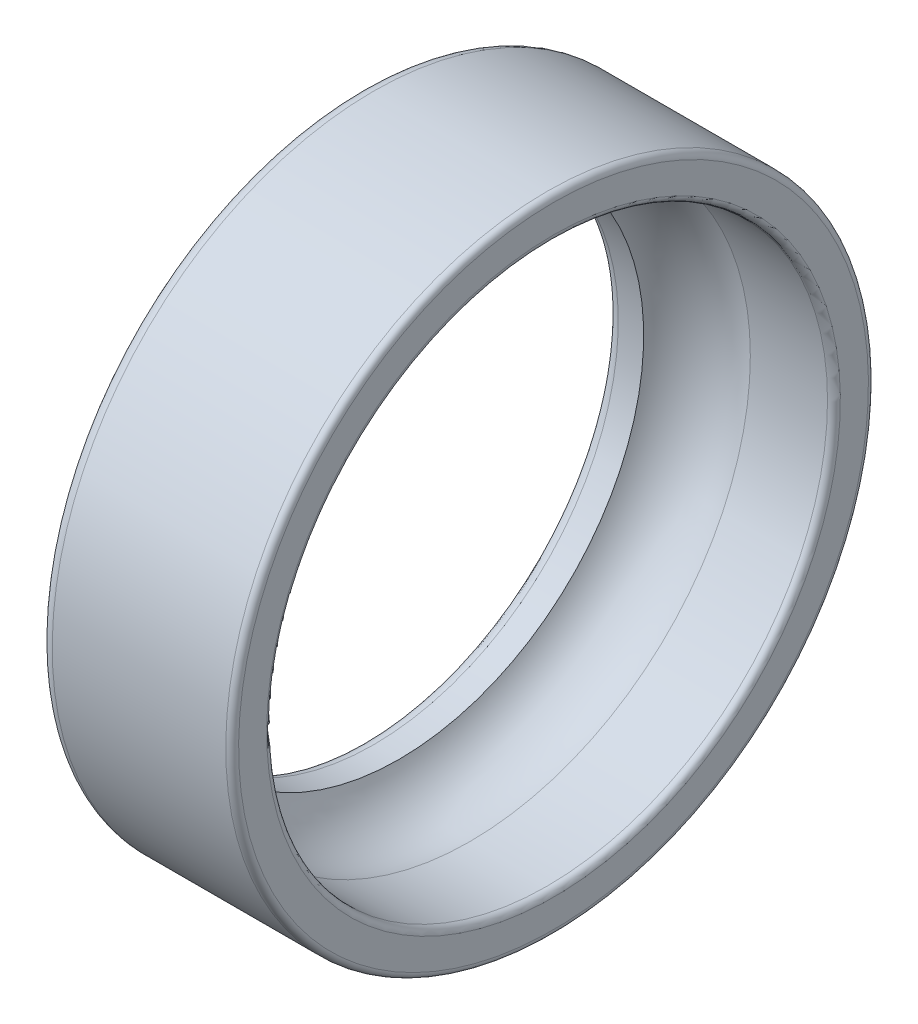
ISO-10303-21;
HEADER;
FILE_DESCRIPTION(('STEP AP214'),'2;1');
FILE_NAME('part.step','',(''),(''),'','','');
FILE_SCHEMA(('AUTOMOTIVE_DESIGN { 1 0 10303 214 1 1 1 1 }'));
ENDSEC;
DATA;
#1=APPLICATION_CONTEXT('core data for automotive mechanical design processes');
#2=APPLICATION_PROTOCOL_DEFINITION('international standard','automotive_design',2000,#1);
#3=PRODUCT_CONTEXT('',#1,'mechanical');
#4=PRODUCT('Part','Part','',(#3));
#5=PRODUCT_RELATED_PRODUCT_CATEGORY('part','',(#4));
#6=PRODUCT_DEFINITION_FORMATION('','',#4);
#7=PRODUCT_DEFINITION_CONTEXT('part definition',#1,'design');
#8=PRODUCT_DEFINITION('design','',#6,#7);
#9=PRODUCT_DEFINITION_SHAPE('','',#8);
#10=(LENGTH_UNIT() NAMED_UNIT(*) SI_UNIT(.MILLI.,.METRE.));
#11=(NAMED_UNIT(*) PLANE_ANGLE_UNIT() SI_UNIT($,.RADIAN.));
#12=(NAMED_UNIT(*) SI_UNIT($,.STERADIAN.) SOLID_ANGLE_UNIT());
#13=UNCERTAINTY_MEASURE_WITH_UNIT(LENGTH_MEASURE(1.E-05),#10,'distance_accuracy_value','');
#14=(GEOMETRIC_REPRESENTATION_CONTEXT(3) GLOBAL_UNCERTAINTY_ASSIGNED_CONTEXT((#13)) GLOBAL_UNIT_ASSIGNED_CONTEXT((#10,
#11,#12)) REPRESENTATION_CONTEXT('',''));
#15=CARTESIAN_POINT('',(0.,0.,0.));
#16=DIRECTION('',(0.,0.,1.));
#17=DIRECTION('',(1.,0.,0.));
#18=AXIS2_PLACEMENT_3D('',#15,#16,#17);
#19=CARTESIAN_POINT('',(1.19220997573263,0.,0.));
#20=DIRECTION('',(-1.,0.,0.));
#21=DIRECTION('',(0.,1.,0.));
#22=AXIS2_PLACEMENT_3D('',#19,#20,#21);
#23=CYLINDRICAL_SURFACE('',#22,11.425);
#24=CARTESIAN_POINT('',(1.78441995146525,0.,0.));
#25=DIRECTION('',(1.,0.,0.));
#26=DIRECTION('',(0.,1.,0.));
#27=AXIS2_PLACEMENT_3D('',#24,#25,#26);
#28=CIRCLE('',#27,11.425);
#29=CARTESIAN_POINT('',(1.78441995146525,11.425,0.));
#30=VERTEX_POINT('',#29);
#31=EDGE_CURVE('E11',#30,#30,#28,.T.);
#32=ORIENTED_EDGE('',*,*,#31,.T.);
#33=EDGE_LOOP('',(#32));
#34=FACE_BOUND('',#33,.T.);
#35=CARTESIAN_POINT('',(0.6,0.,0.));
#36=DIRECTION('',(1.,0.,0.));
#37=DIRECTION('',(0.,1.,0.));
#38=AXIS2_PLACEMENT_3D('',#35,#36,#37);
#39=CIRCLE('',#38,11.425);
#40=CARTESIAN_POINT('',(0.6,11.425,0.));
#41=VERTEX_POINT('',#40);
#42=EDGE_CURVE('E71',#41,#41,#39,.T.);
#43=ORIENTED_EDGE('',*,*,#42,.F.);
#44=EDGE_LOOP('',(#43));
#45=FACE_BOUND('',#44,.T.);
#46=ADVANCED_FACE('F17',(#34,#45),#23,.F.);
#47=CARTESIAN_POINT('',(4.5,0.,0.));
#48=DIRECTION('',(1.,0.,0.));
#49=DIRECTION('',(0.,0.,-1.));
#50=AXIS2_PLACEMENT_3D('',#47,#48,#49);
#51=TOROIDAL_SURFACE('',#50,10.15,3.);
#52=CARTESIAN_POINT('',(5.096992462264,0.,0.));
#53=DIRECTION('',(1.,0.,0.));
#54=DIRECTION('',(0.,1.,0.));
#55=AXIS2_PLACEMENT_3D('',#52,#53,#54);
#56=CIRCLE('',#55,13.09);
#57=CARTESIAN_POINT('',(5.096992462264,13.09,0.));
#58=VERTEX_POINT('',#57);
#59=EDGE_CURVE('E21',#58,#58,#56,.T.);
#60=ORIENTED_EDGE('',*,*,#59,.T.);
#61=EDGE_LOOP('',(#60));
#62=FACE_BOUND('',#61,.T.);
#63=ORIENTED_EDGE('',*,*,#31,.F.);
#64=EDGE_LOOP('',(#63));
#65=FACE_BOUND('',#64,.T.);
#66=ADVANCED_FACE('F87',(#62,#65),#51,.F.);
#67=CARTESIAN_POINT('',(6.898496231132,0.,0.));
#68=DIRECTION('',(-1.,0.,0.));
#69=DIRECTION('',(0.,1.,0.));
#70=AXIS2_PLACEMENT_3D('',#67,#68,#69);
#71=CYLINDRICAL_SURFACE('',#70,13.09);
#72=CARTESIAN_POINT('',(8.7,0.,0.));
#73=DIRECTION('',(1.,0.,0.));
#74=DIRECTION('',(0.,1.,0.));
#75=AXIS2_PLACEMENT_3D('',#72,#73,#74);
#76=CIRCLE('',#75,13.09);
#77=CARTESIAN_POINT('',(8.7,13.09,0.));
#78=VERTEX_POINT('',#77);
#79=EDGE_CURVE('E59',#78,#78,#76,.T.);
#80=ORIENTED_EDGE('',*,*,#79,.T.);
#81=EDGE_LOOP('',(#80));
#82=FACE_BOUND('',#81,.T.);
#83=ORIENTED_EDGE('',*,*,#59,.F.);
#84=EDGE_LOOP('',(#83));
#85=FACE_BOUND('',#84,.T.);
#86=ADVANCED_FACE('F60',(#82,#85),#71,.F.);
#87=CARTESIAN_POINT('',(8.7,0.,0.));
#88=DIRECTION('',(1.,0.,0.));
#89=DIRECTION('',(0.,0.,-1.));
#90=AXIS2_PLACEMENT_3D('',#87,#88,#89);
#91=TOROIDAL_SURFACE('',#90,13.39,0.3);
#92=CARTESIAN_POINT('',(9.,0.,0.));
#93=DIRECTION('',(1.,0.,0.));
#94=DIRECTION('',(0.,1.,0.));
#95=AXIS2_PLACEMENT_3D('',#92,#93,#94);
#96=CIRCLE('',#95,13.39);
#97=CARTESIAN_POINT('',(9.,13.39,0.));
#98=VERTEX_POINT('',#97);
#99=EDGE_CURVE('E63',#98,#98,#96,.T.);
#100=ORIENTED_EDGE('',*,*,#99,.T.);
#101=EDGE_LOOP('',(#100));
#102=FACE_BOUND('',#101,.T.);
#103=ORIENTED_EDGE('',*,*,#79,.F.);
#104=EDGE_LOOP('',(#103));
#105=FACE_BOUND('',#104,.T.);
#106=ADVANCED_FACE('F106',(#102,#105),#91,.T.);
#107=CARTESIAN_POINT('',(9.,14.045,0.));
#108=DIRECTION('',(1.,0.,0.));
#109=DIRECTION('',(0.,1.,0.));
#110=AXIS2_PLACEMENT_3D('',#107,#108,#109);
#111=PLANE('',#110);
#112=CARTESIAN_POINT('',(9.,0.,0.));
#113=DIRECTION('',(1.,0.,0.));
#114=DIRECTION('',(0.,1.,0.));
#115=AXIS2_PLACEMENT_3D('',#112,#113,#114);
#116=CIRCLE('',#115,14.7);
#117=CARTESIAN_POINT('',(9.,14.7,0.));
#118=VERTEX_POINT('',#117);
#119=EDGE_CURVE('E44',#118,#118,#116,.T.);
#120=ORIENTED_EDGE('',*,*,#119,.T.);
#121=EDGE_LOOP('',(#120));
#122=FACE_BOUND('',#121,.T.);
#123=ORIENTED_EDGE('',*,*,#99,.F.);
#124=EDGE_LOOP('',(#123));
#125=FACE_BOUND('',#124,.T.);
#126=ADVANCED_FACE('F105',(#122,#125),#111,.T.);
#127=CARTESIAN_POINT('',(8.7,0.,0.));
#128=DIRECTION('',(1.,0.,0.));
#129=DIRECTION('',(0.,0.,-1.));
#130=AXIS2_PLACEMENT_3D('',#127,#128,#129);
#131=TOROIDAL_SURFACE('',#130,14.7,0.3);
#132=CARTESIAN_POINT('',(8.7,0.,0.));
#133=DIRECTION('',(1.,0.,0.));
#134=DIRECTION('',(0.,1.,0.));
#135=AXIS2_PLACEMENT_3D('',#132,#133,#134);
#136=CIRCLE('',#135,15.);
#137=CARTESIAN_POINT('',(8.7,15.,0.));
#138=VERTEX_POINT('',#137);
#139=EDGE_CURVE('E51',#138,#138,#136,.T.);
#140=ORIENTED_EDGE('',*,*,#139,.T.);
#141=EDGE_LOOP('',(#140));
#142=FACE_BOUND('',#141,.T.);
#143=ORIENTED_EDGE('',*,*,#119,.F.);
#144=EDGE_LOOP('',(#143));
#145=FACE_BOUND('',#144,.T.);
#146=ADVANCED_FACE('F102',(#142,#145),#131,.T.);
#147=CARTESIAN_POINT('',(4.65,0.,0.));
#148=DIRECTION('',(-1.,0.,0.));
#149=DIRECTION('',(0.,1.,0.));
#150=AXIS2_PLACEMENT_3D('',#147,#148,#149);
#151=CYLINDRICAL_SURFACE('',#150,15.);
#152=CARTESIAN_POINT('',(0.6,0.,0.));
#153=DIRECTION('',(1.,0.,0.));
#154=DIRECTION('',(0.,1.,0.));
#155=AXIS2_PLACEMENT_3D('',#152,#153,#154);
#156=CIRCLE('',#155,15.);
#157=CARTESIAN_POINT('',(0.6,15.,0.));
#158=VERTEX_POINT('',#157);
#159=EDGE_CURVE('E70',#158,#158,#156,.T.);
#160=ORIENTED_EDGE('',*,*,#159,.T.);
#161=EDGE_LOOP('',(#160));
#162=FACE_BOUND('',#161,.T.);
#163=ORIENTED_EDGE('',*,*,#139,.F.);
#164=EDGE_LOOP('',(#163));
#165=FACE_BOUND('',#164,.T.);
#166=ADVANCED_FACE('F19',(#162,#165),#151,.T.);
#167=CARTESIAN_POINT('',(0.6,0.,0.));
#168=DIRECTION('',(1.,0.,0.));
#169=DIRECTION('',(0.,0.,-1.));
#170=AXIS2_PLACEMENT_3D('',#167,#168,#169);
#171=TOROIDAL_SURFACE('',#170,14.4,0.6);
#172=CARTESIAN_POINT('',(0.,0.,0.));
#173=DIRECTION('',(1.,0.,0.));
#174=DIRECTION('',(0.,1.,0.));
#175=AXIS2_PLACEMENT_3D('',#172,#173,#174);
#176=CIRCLE('',#175,14.4);
#177=CARTESIAN_POINT('',(0.,14.4,0.));
#178=VERTEX_POINT('',#177);
#179=EDGE_CURVE('E68',#178,#178,#176,.T.);
#180=ORIENTED_EDGE('',*,*,#179,.T.);
#181=EDGE_LOOP('',(#180));
#182=FACE_BOUND('',#181,.T.);
#183=ORIENTED_EDGE('',*,*,#159,.F.);
#184=EDGE_LOOP('',(#183));
#185=FACE_BOUND('',#184,.T.);
#186=ADVANCED_FACE('F100',(#182,#185),#171,.T.);
#187=CARTESIAN_POINT('',(0.,13.2125,0.));
#188=DIRECTION('',(-1.,0.,0.));
#189=DIRECTION('',(0.,-1.,0.));
#190=AXIS2_PLACEMENT_3D('',#187,#188,#189);
#191=PLANE('',#190);
#192=CARTESIAN_POINT('',(0.,0.,0.));
#193=DIRECTION('',(1.,0.,0.));
#194=DIRECTION('',(0.,1.,0.));
#195=AXIS2_PLACEMENT_3D('',#192,#193,#194);
#196=CIRCLE('',#195,12.025);
#197=CARTESIAN_POINT('',(0.,12.025,0.));
#198=VERTEX_POINT('',#197);
#199=EDGE_CURVE('E76',#198,#198,#196,.T.);
#200=ORIENTED_EDGE('',*,*,#199,.T.);
#201=EDGE_LOOP('',(#200));
#202=FACE_BOUND('',#201,.T.);
#203=ORIENTED_EDGE('',*,*,#179,.F.);
#204=EDGE_LOOP('',(#203));
#205=FACE_BOUND('',#204,.T.);
#206=ADVANCED_FACE('F97',(#202,#205),#191,.T.);
#207=CARTESIAN_POINT('',(0.6,0.,0.));
#208=DIRECTION('',(1.,0.,0.));
#209=DIRECTION('',(0.,0.,-1.));
#210=AXIS2_PLACEMENT_3D('',#207,#208,#209);
#211=TOROIDAL_SURFACE('',#210,12.025,0.6);
#212=ORIENTED_EDGE('',*,*,#42,.T.);
#213=EDGE_LOOP('',(#212));
#214=FACE_BOUND('',#213,.T.);
#215=ORIENTED_EDGE('',*,*,#199,.F.);
#216=EDGE_LOOP('',(#215));
#217=FACE_BOUND('',#216,.T.);
#218=ADVANCED_FACE('F83',(#214,#217),#211,.T.);
#219=CLOSED_SHELL('',(#46,#66,#86,#106,#126,#146,#166,#186,#206,#218));
#220=MANIFOLD_SOLID_BREP('B1',#219);
#221=ADVANCED_BREP_SHAPE_REPRESENTATION('',(#18,#220),#14);
#222=SHAPE_DEFINITION_REPRESENTATION(#9,#221);
ENDSEC;
END-ISO-10303-21;
